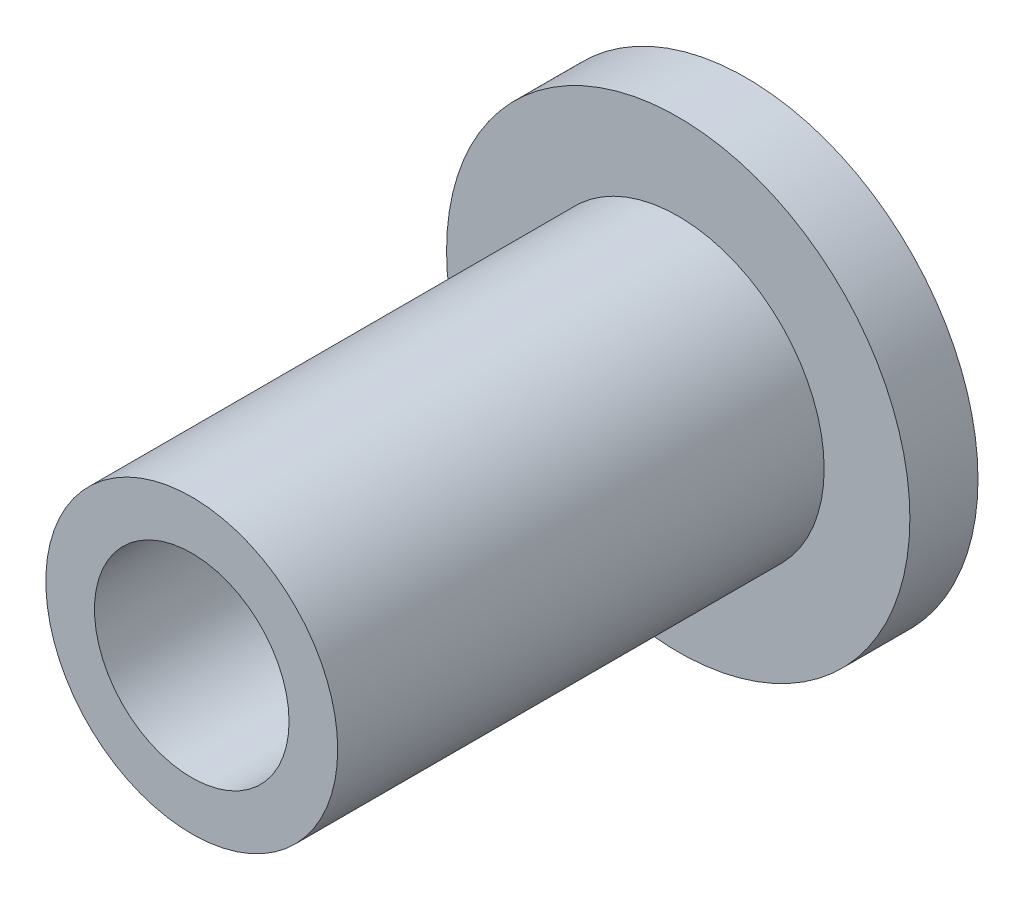
ISO-10303-21;
HEADER;
FILE_DESCRIPTION(('STEP AP214'),'2;1');
FILE_NAME('part.step','',(''),(''),'','','');
FILE_SCHEMA(('AUTOMOTIVE_DESIGN { 1 0 10303 214 1 1 1 1 }'));
ENDSEC;
DATA;
#1=APPLICATION_CONTEXT('core data for automotive mechanical design processes');
#2=APPLICATION_PROTOCOL_DEFINITION('international standard','automotive_design',2000,#1);
#3=PRODUCT_CONTEXT('',#1,'mechanical');
#4=PRODUCT('Part','Part','',(#3));
#5=PRODUCT_RELATED_PRODUCT_CATEGORY('part','',(#4));
#6=PRODUCT_DEFINITION_FORMATION('','',#4);
#7=PRODUCT_DEFINITION_CONTEXT('part definition',#1,'design');
#8=PRODUCT_DEFINITION('design','',#6,#7);
#9=PRODUCT_DEFINITION_SHAPE('','',#8);
#10=(LENGTH_UNIT() NAMED_UNIT(*) SI_UNIT(.MILLI.,.METRE.));
#11=(NAMED_UNIT(*) PLANE_ANGLE_UNIT() SI_UNIT($,.RADIAN.));
#12=(NAMED_UNIT(*) SI_UNIT($,.STERADIAN.) SOLID_ANGLE_UNIT());
#13=UNCERTAINTY_MEASURE_WITH_UNIT(LENGTH_MEASURE(1.E-05),#10,'distance_accuracy_value','');
#14=(GEOMETRIC_REPRESENTATION_CONTEXT(3) GLOBAL_UNCERTAINTY_ASSIGNED_CONTEXT((#13)) GLOBAL_UNIT_ASSIGNED_CONTEXT((#10,
#11,#12)) REPRESENTATION_CONTEXT('',''));
#15=CARTESIAN_POINT('',(0.,0.,0.));
#16=DIRECTION('',(0.,0.,1.));
#17=DIRECTION('',(1.,0.,0.));
#18=AXIS2_PLACEMENT_3D('',#15,#16,#17);
#19=CARTESIAN_POINT('',(0.,0.,1.4));
#20=DIRECTION('',(0.,0.,1.));
#21=DIRECTION('',(1.,0.,0.));
#22=AXIS2_PLACEMENT_3D('',#19,#20,#21);
#23=PLANE('',#22);
#24=CARTESIAN_POINT('',(0.,0.,1.4));
#25=DIRECTION('',(0.,0.,1.));
#26=DIRECTION('',(1.,0.,0.));
#27=AXIS2_PLACEMENT_3D('',#24,#25,#26);
#28=CIRCLE('',#27,3.);
#29=CARTESIAN_POINT('',(3.,0.,1.4));
#30=VERTEX_POINT('',#29);
#31=EDGE_CURVE('E10',#30,#30,#28,.T.);
#32=ORIENTED_EDGE('',*,*,#31,.F.);
#33=EDGE_LOOP('',(#32));
#34=FACE_BOUND('',#33,.T.);
#35=CARTESIAN_POINT('',(0.,0.,1.4));
#36=DIRECTION('',(0.,0.,1.));
#37=DIRECTION('',(1.,0.,0.));
#38=AXIS2_PLACEMENT_3D('',#35,#36,#37);
#39=CIRCLE('',#38,4.7625);
#40=CARTESIAN_POINT('',(4.7625,0.,1.4));
#41=VERTEX_POINT('',#40);
#42=EDGE_CURVE('E55',#41,#41,#39,.T.);
#43=ORIENTED_EDGE('',*,*,#42,.T.);
#44=EDGE_LOOP('',(#43));
#45=FACE_BOUND('',#44,.T.);
#46=ADVANCED_FACE('F43',(#34,#45),#23,.T.);
#47=CARTESIAN_POINT('',(0.,0.,0.));
#48=DIRECTION('',(0.,0.,1.));
#49=DIRECTION('',(1.,0.,0.));
#50=AXIS2_PLACEMENT_3D('',#47,#48,#49);
#51=PLANE('',#50);
#52=CARTESIAN_POINT('',(0.,0.,0.));
#53=DIRECTION('',(0.,0.,1.));
#54=DIRECTION('',(1.,0.,0.));
#55=AXIS2_PLACEMENT_3D('',#52,#53,#54);
#56=CIRCLE('',#55,4.7625);
#57=CARTESIAN_POINT('',(4.7625,0.,0.));
#58=VERTEX_POINT('',#57);
#59=EDGE_CURVE('E50',#58,#58,#56,.T.);
#60=ORIENTED_EDGE('',*,*,#59,.F.);
#61=EDGE_LOOP('',(#60));
#62=FACE_BOUND('',#61,.T.);
#63=CARTESIAN_POINT('',(0.,0.,0.));
#64=DIRECTION('',(0.,0.,1.));
#65=DIRECTION('',(1.,0.,0.));
#66=AXIS2_PLACEMENT_3D('',#63,#64,#65);
#67=CIRCLE('',#66,2.);
#68=CARTESIAN_POINT('',(2.,0.,0.));
#69=VERTEX_POINT('',#68);
#70=EDGE_CURVE('E65',#69,#69,#67,.T.);
#71=ORIENTED_EDGE('',*,*,#70,.T.);
#72=EDGE_LOOP('',(#71));
#73=FACE_BOUND('',#72,.T.);
#74=ADVANCED_FACE('F91',(#62,#73),#51,.F.);
#75=CARTESIAN_POINT('',(0.,0.,1.4));
#76=DIRECTION('',(0.,0.,-1.));
#77=DIRECTION('',(-1.,0.,0.));
#78=AXIS2_PLACEMENT_3D('',#75,#76,#77);
#79=CYLINDRICAL_SURFACE('',#78,4.7625);
#80=ORIENTED_EDGE('',*,*,#42,.F.);
#81=EDGE_LOOP('',(#80));
#82=FACE_BOUND('',#81,.T.);
#83=ORIENTED_EDGE('',*,*,#59,.T.);
#84=EDGE_LOOP('',(#83));
#85=FACE_BOUND('',#84,.T.);
#86=ADVANCED_FACE('F44',(#82,#85),#79,.T.);
#87=CARTESIAN_POINT('',(0.,0.,1.4));
#88=DIRECTION('',(0.,0.,-1.));
#89=DIRECTION('',(-1.,0.,0.));
#90=AXIS2_PLACEMENT_3D('',#87,#88,#89);
#91=CYLINDRICAL_SURFACE('',#90,2.);
#92=ORIENTED_EDGE('',*,*,#70,.F.);
#93=EDGE_LOOP('',(#92));
#94=FACE_BOUND('',#93,.T.);
#95=CARTESIAN_POINT('',(0.,0.,11.4));
#96=DIRECTION('',(0.,0.,1.));
#97=DIRECTION('',(1.,0.,0.));
#98=AXIS2_PLACEMENT_3D('',#95,#96,#97);
#99=CIRCLE('',#98,2.);
#100=CARTESIAN_POINT('',(2.,0.,11.4));
#101=VERTEX_POINT('',#100);
#102=EDGE_CURVE('E72',#101,#101,#99,.T.);
#103=ORIENTED_EDGE('',*,*,#102,.T.);
#104=EDGE_LOOP('',(#103));
#105=FACE_BOUND('',#104,.T.);
#106=ADVANCED_FACE('F79',(#94,#105),#91,.F.);
#107=CARTESIAN_POINT('',(0.,0.,11.4));
#108=DIRECTION('',(0.,0.,1.));
#109=DIRECTION('',(1.,0.,0.));
#110=AXIS2_PLACEMENT_3D('',#107,#108,#109);
#111=PLANE('',#110);
#112=CARTESIAN_POINT('',(0.,0.,11.4));
#113=DIRECTION('',(0.,0.,1.));
#114=DIRECTION('',(1.,0.,0.));
#115=AXIS2_PLACEMENT_3D('',#112,#113,#114);
#116=CIRCLE('',#115,3.);
#117=CARTESIAN_POINT('',(3.,0.,11.4));
#118=VERTEX_POINT('',#117);
#119=EDGE_CURVE('E58',#118,#118,#116,.T.);
#120=ORIENTED_EDGE('',*,*,#119,.T.);
#121=EDGE_LOOP('',(#120));
#122=FACE_BOUND('',#121,.T.);
#123=ORIENTED_EDGE('',*,*,#102,.F.);
#124=EDGE_LOOP('',(#123));
#125=FACE_BOUND('',#124,.T.);
#126=ADVANCED_FACE('F78',(#122,#125),#111,.T.);
#127=CARTESIAN_POINT('',(0.,0.,11.4));
#128=DIRECTION('',(0.,0.,-1.));
#129=DIRECTION('',(-1.,0.,0.));
#130=AXIS2_PLACEMENT_3D('',#127,#128,#129);
#131=CYLINDRICAL_SURFACE('',#130,3.);
#132=ORIENTED_EDGE('',*,*,#119,.F.);
#133=EDGE_LOOP('',(#132));
#134=FACE_BOUND('',#133,.T.);
#135=ORIENTED_EDGE('',*,*,#31,.T.);
#136=EDGE_LOOP('',(#135));
#137=FACE_BOUND('',#136,.T.);
#138=ADVANCED_FACE('F82',(#134,#137),#131,.T.);
#139=CLOSED_SHELL('',(#46,#74,#86,#106,#126,#138));
#140=MANIFOLD_SOLID_BREP('B2',#139);
#141=ADVANCED_BREP_SHAPE_REPRESENTATION('',(#18,#140),#14);
#142=SHAPE_DEFINITION_REPRESENTATION(#9,#141);
ENDSEC;
END-ISO-10303-21;
